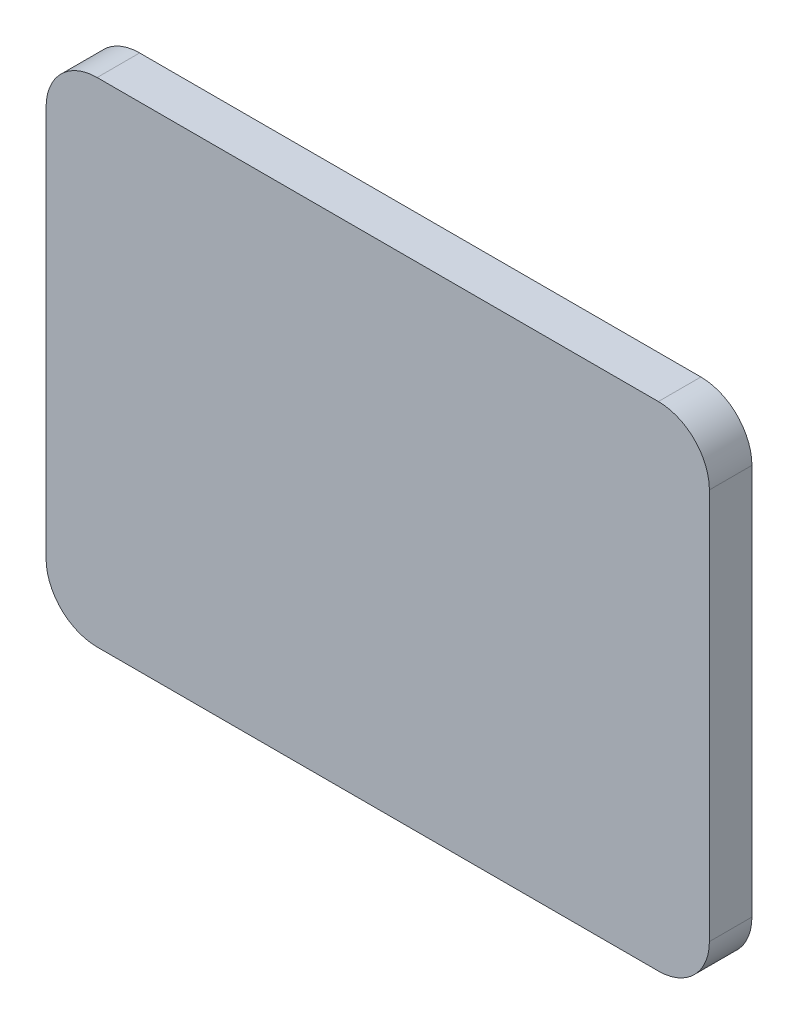
ISO-10303-21;
HEADER;
FILE_DESCRIPTION(('STEP AP214'),'2;1');
FILE_NAME('part.step','',(''),(''),'','','');
FILE_SCHEMA(('AUTOMOTIVE_DESIGN { 1 0 10303 214 1 1 1 1 }'));
ENDSEC;
DATA;
#1=APPLICATION_CONTEXT('core data for automotive mechanical design processes');
#2=APPLICATION_PROTOCOL_DEFINITION('international standard','automotive_design',2000,#1);
#3=PRODUCT_CONTEXT('',#1,'mechanical');
#4=PRODUCT('Part','Part','',(#3));
#5=PRODUCT_RELATED_PRODUCT_CATEGORY('part','',(#4));
#6=PRODUCT_DEFINITION_FORMATION('','',#4);
#7=PRODUCT_DEFINITION_CONTEXT('part definition',#1,'design');
#8=PRODUCT_DEFINITION('design','',#6,#7);
#9=PRODUCT_DEFINITION_SHAPE('','',#8);
#10=(LENGTH_UNIT() NAMED_UNIT(*) SI_UNIT(.MILLI.,.METRE.));
#11=(NAMED_UNIT(*) PLANE_ANGLE_UNIT() SI_UNIT($,.RADIAN.));
#12=(NAMED_UNIT(*) SI_UNIT($,.STERADIAN.) SOLID_ANGLE_UNIT());
#13=UNCERTAINTY_MEASURE_WITH_UNIT(LENGTH_MEASURE(1.E-05),#10,'distance_accuracy_value','');
#14=(GEOMETRIC_REPRESENTATION_CONTEXT(3) GLOBAL_UNCERTAINTY_ASSIGNED_CONTEXT((#13)) GLOBAL_UNIT_ASSIGNED_CONTEXT((#10,
#11,#12)) REPRESENTATION_CONTEXT('',''));
#15=CARTESIAN_POINT('',(0.,0.,0.));
#16=DIRECTION('',(0.,0.,1.));
#17=DIRECTION('',(1.,0.,0.));
#18=AXIS2_PLACEMENT_3D('',#15,#16,#17);
#19=CARTESIAN_POINT('',(49.53,36.83,6.35));
#20=DIRECTION('',(-1.,0.,0.));
#21=DIRECTION('',(0.,-1.,0.));
#22=AXIS2_PLACEMENT_3D('',#19,#20,#21);
#23=PLANE('',#22);
#24=DIRECTION('',(0.,1.,0.));
#25=VECTOR('',#24,1.);
#26=CARTESIAN_POINT('',(49.53,36.83,6.35));
#27=LINE('',#26,#25);
#28=CARTESIAN_POINT('',(49.53,-29.21,6.35));
#29=VERTEX_POINT('',#28);
#30=CARTESIAN_POINT('',(49.53,29.21,6.35));
#31=VERTEX_POINT('',#30);
#32=EDGE_CURVE('E139',#29,#31,#27,.T.);
#33=ORIENTED_EDGE('',*,*,#32,.F.);
#34=DIRECTION('',(0.,0.,-1.));
#35=VECTOR('',#34,1.);
#36=CARTESIAN_POINT('',(49.53,-29.21,6.35));
#37=LINE('',#36,#35);
#38=CARTESIAN_POINT('',(49.53,-29.21,0.));
#39=VERTEX_POINT('',#38);
#40=EDGE_CURVE('E178',#29,#39,#37,.T.);
#41=ORIENTED_EDGE('',*,*,#40,.T.);
#42=DIRECTION('',(0.,1.,0.));
#43=VECTOR('',#42,1.);
#44=CARTESIAN_POINT('',(49.53,36.83,0.));
#45=LINE('',#44,#43);
#46=CARTESIAN_POINT('',(49.53,29.21,0.));
#47=VERTEX_POINT('',#46);
#48=EDGE_CURVE('E192',#39,#47,#45,.T.);
#49=ORIENTED_EDGE('',*,*,#48,.T.);
#50=DIRECTION('',(0.,0.,-1.));
#51=VECTOR('',#50,1.);
#52=CARTESIAN_POINT('',(49.53,29.21,6.35));
#53=LINE('',#52,#51);
#54=EDGE_CURVE('E175',#47,#31,#53,.F.);
#55=ORIENTED_EDGE('',*,*,#54,.T.);
#56=EDGE_LOOP('',(#33,#41,#49,#55));
#57=FACE_BOUND('',#56,.T.);
#58=ADVANCED_FACE('F43',(#57),#23,.F.);
#59=CARTESIAN_POINT('',(-49.53,36.83,6.35));
#60=DIRECTION('',(0.,-1.,0.));
#61=DIRECTION('',(0.,0.,-1.));
#62=AXIS2_PLACEMENT_3D('',#59,#60,#61);
#63=PLANE('',#62);
#64=DIRECTION('',(-1.,0.,0.));
#65=VECTOR('',#64,1.);
#66=CARTESIAN_POINT('',(-49.53,36.83,6.35));
#67=LINE('',#66,#65);
#68=CARTESIAN_POINT('',(41.91,36.83,6.35));
#69=VERTEX_POINT('',#68);
#70=CARTESIAN_POINT('',(-41.91,36.83,6.35));
#71=VERTEX_POINT('',#70);
#72=EDGE_CURVE('E144',#69,#71,#67,.T.);
#73=ORIENTED_EDGE('',*,*,#72,.F.);
#74=DIRECTION('',(0.,0.,-1.));
#75=VECTOR('',#74,1.);
#76=CARTESIAN_POINT('',(41.91,36.83,6.35));
#77=LINE('',#76,#75);
#78=CARTESIAN_POINT('',(41.91,36.83,0.));
#79=VERTEX_POINT('',#78);
#80=EDGE_CURVE('E11',#69,#79,#77,.T.);
#81=ORIENTED_EDGE('',*,*,#80,.T.);
#82=DIRECTION('',(-1.,0.,0.));
#83=VECTOR('',#82,1.);
#84=CARTESIAN_POINT('',(-49.53,36.83,0.));
#85=LINE('',#84,#83);
#86=CARTESIAN_POINT('',(-41.91,36.83,0.));
#87=VERTEX_POINT('',#86);
#88=EDGE_CURVE('E146',#79,#87,#85,.T.);
#89=ORIENTED_EDGE('',*,*,#88,.T.);
#90=DIRECTION('',(0.,0.,-1.));
#91=VECTOR('',#90,1.);
#92=CARTESIAN_POINT('',(-41.91,36.83,6.35));
#93=LINE('',#92,#91);
#94=EDGE_CURVE('E52',#87,#71,#93,.F.);
#95=ORIENTED_EDGE('',*,*,#94,.T.);
#96=EDGE_LOOP('',(#73,#81,#89,#95));
#97=FACE_BOUND('',#96,.T.);
#98=ADVANCED_FACE('F197',(#97),#63,.F.);
#99=CARTESIAN_POINT('',(-49.53,36.83,6.35));
#100=DIRECTION('',(1.,0.,0.));
#101=DIRECTION('',(0.,1.,0.));
#102=AXIS2_PLACEMENT_3D('',#99,#100,#101);
#103=PLANE('',#102);
#104=DIRECTION('',(0.,-1.,0.));
#105=VECTOR('',#104,1.);
#106=CARTESIAN_POINT('',(-49.53,36.83,0.));
#107=LINE('',#106,#105);
#108=CARTESIAN_POINT('',(-49.53,29.21,0.));
#109=VERTEX_POINT('',#108);
#110=CARTESIAN_POINT('',(-49.53,-29.21,0.));
#111=VERTEX_POINT('',#110);
#112=EDGE_CURVE('E140',#109,#111,#107,.T.);
#113=ORIENTED_EDGE('',*,*,#112,.T.);
#114=DIRECTION('',(0.,0.,-1.));
#115=VECTOR('',#114,1.);
#116=CARTESIAN_POINT('',(-49.53,-29.21,6.35));
#117=LINE('',#116,#115);
#118=CARTESIAN_POINT('',(-49.53,-29.21,6.35));
#119=VERTEX_POINT('',#118);
#120=EDGE_CURVE('E115',#111,#119,#117,.F.);
#121=ORIENTED_EDGE('',*,*,#120,.T.);
#122=DIRECTION('',(0.,-1.,0.));
#123=VECTOR('',#122,1.);
#124=CARTESIAN_POINT('',(-49.53,36.83,6.35));
#125=LINE('',#124,#123);
#126=CARTESIAN_POINT('',(-49.53,29.21,6.35));
#127=VERTEX_POINT('',#126);
#128=EDGE_CURVE('E184',#127,#119,#125,.T.);
#129=ORIENTED_EDGE('',*,*,#128,.F.);
#130=DIRECTION('',(0.,0.,-1.));
#131=VECTOR('',#130,1.);
#132=CARTESIAN_POINT('',(-49.53,29.21,6.35));
#133=LINE('',#132,#131);
#134=EDGE_CURVE('E121',#127,#109,#133,.T.);
#135=ORIENTED_EDGE('',*,*,#134,.T.);
#136=EDGE_LOOP('',(#113,#121,#129,#135));
#137=FACE_BOUND('',#136,.T.);
#138=ADVANCED_FACE('F204',(#137),#103,.F.);
#139=CARTESIAN_POINT('',(-49.53,-36.83,6.35));
#140=DIRECTION('',(0.,1.,0.));
#141=DIRECTION('',(0.,0.,1.));
#142=AXIS2_PLACEMENT_3D('',#139,#140,#141);
#143=PLANE('',#142);
#144=DIRECTION('',(1.,0.,0.));
#145=VECTOR('',#144,1.);
#146=CARTESIAN_POINT('',(-49.53,-36.83,6.35));
#147=LINE('',#146,#145);
#148=CARTESIAN_POINT('',(-41.91,-36.83,6.35));
#149=VERTEX_POINT('',#148);
#150=CARTESIAN_POINT('',(41.91,-36.83,6.35));
#151=VERTEX_POINT('',#150);
#152=EDGE_CURVE('E131',#149,#151,#147,.T.);
#153=ORIENTED_EDGE('',*,*,#152,.F.);
#154=DIRECTION('',(0.,0.,-1.));
#155=VECTOR('',#154,1.);
#156=CARTESIAN_POINT('',(-41.91,-36.83,6.35));
#157=LINE('',#156,#155);
#158=CARTESIAN_POINT('',(-41.91,-36.83,0.));
#159=VERTEX_POINT('',#158);
#160=EDGE_CURVE('E114',#149,#159,#157,.T.);
#161=ORIENTED_EDGE('',*,*,#160,.T.);
#162=DIRECTION('',(1.,0.,0.));
#163=VECTOR('',#162,1.);
#164=CARTESIAN_POINT('',(-49.53,-36.83,0.));
#165=LINE('',#164,#163);
#166=CARTESIAN_POINT('',(41.91,-36.83,0.));
#167=VERTEX_POINT('',#166);
#168=EDGE_CURVE('E128',#159,#167,#165,.T.);
#169=ORIENTED_EDGE('',*,*,#168,.T.);
#170=DIRECTION('',(0.,0.,-1.));
#171=VECTOR('',#170,1.);
#172=CARTESIAN_POINT('',(41.91,-36.83,6.35));
#173=LINE('',#172,#171);
#174=EDGE_CURVE('E134',#167,#151,#173,.F.);
#175=ORIENTED_EDGE('',*,*,#174,.T.);
#176=EDGE_LOOP('',(#153,#161,#169,#175));
#177=FACE_BOUND('',#176,.T.);
#178=ADVANCED_FACE('F127',(#177),#143,.F.);
#179=CARTESIAN_POINT('',(0.,0.,6.35));
#180=DIRECTION('',(0.,0.,1.));
#181=DIRECTION('',(1.,0.,0.));
#182=AXIS2_PLACEMENT_3D('',#179,#180,#181);
#183=PLANE('',#182);
#184=ORIENTED_EDGE('',*,*,#128,.T.);
#185=CARTESIAN_POINT('',(-41.91,-29.21,6.35));
#186=DIRECTION('',(0.,0.,1.));
#187=DIRECTION('',(1.,0.,0.));
#188=AXIS2_PLACEMENT_3D('',#185,#186,#187);
#189=CIRCLE('',#188,7.62);
#190=EDGE_CURVE('E172',#119,#149,#189,.T.);
#191=ORIENTED_EDGE('',*,*,#190,.T.);
#192=ORIENTED_EDGE('',*,*,#152,.T.);
#193=CARTESIAN_POINT('',(41.91,-29.21,6.35));
#194=DIRECTION('',(0.,0.,1.));
#195=DIRECTION('',(1.,0.,0.));
#196=AXIS2_PLACEMENT_3D('',#193,#194,#195);
#197=CIRCLE('',#196,7.62);
#198=EDGE_CURVE('E169',#151,#29,#197,.T.);
#199=ORIENTED_EDGE('',*,*,#198,.T.);
#200=ORIENTED_EDGE('',*,*,#32,.T.);
#201=CARTESIAN_POINT('',(41.91,29.21,6.35));
#202=DIRECTION('',(0.,0.,1.));
#203=DIRECTION('',(1.,0.,0.));
#204=AXIS2_PLACEMENT_3D('',#201,#202,#203);
#205=CIRCLE('',#204,7.62);
#206=EDGE_CURVE('E65',#31,#69,#205,.T.);
#207=ORIENTED_EDGE('',*,*,#206,.T.);
#208=ORIENTED_EDGE('',*,*,#72,.T.);
#209=CARTESIAN_POINT('',(-41.91,29.21,6.35));
#210=DIRECTION('',(0.,0.,1.));
#211=DIRECTION('',(1.,0.,0.));
#212=AXIS2_PLACEMENT_3D('',#209,#210,#211);
#213=CIRCLE('',#212,7.62);
#214=EDGE_CURVE('E164',#71,#127,#213,.T.);
#215=ORIENTED_EDGE('',*,*,#214,.T.);
#216=EDGE_LOOP('',(#184,#191,#192,#199,#200,#207,#208,#215));
#217=FACE_BOUND('',#216,.T.);
#218=ADVANCED_FACE('F202',(#217),#183,.T.);
#219=CARTESIAN_POINT('',(0.,0.,0.));
#220=DIRECTION('',(0.,0.,1.));
#221=DIRECTION('',(1.,0.,0.));
#222=AXIS2_PLACEMENT_3D('',#219,#220,#221);
#223=PLANE('',#222);
#224=ORIENTED_EDGE('',*,*,#168,.F.);
#225=CARTESIAN_POINT('',(-41.91,-29.21,0.));
#226=DIRECTION('',(0.,0.,1.));
#227=DIRECTION('',(1.,0.,0.));
#228=AXIS2_PLACEMENT_3D('',#225,#226,#227);
#229=CIRCLE('',#228,7.62);
#230=EDGE_CURVE('E110',#159,#111,#229,.F.);
#231=ORIENTED_EDGE('',*,*,#230,.T.);
#232=ORIENTED_EDGE('',*,*,#112,.F.);
#233=CARTESIAN_POINT('',(-41.91,29.21,0.));
#234=DIRECTION('',(0.,0.,1.));
#235=DIRECTION('',(1.,0.,0.));
#236=AXIS2_PLACEMENT_3D('',#233,#234,#235);
#237=CIRCLE('',#236,7.62);
#238=EDGE_CURVE('E133',#109,#87,#237,.F.);
#239=ORIENTED_EDGE('',*,*,#238,.T.);
#240=ORIENTED_EDGE('',*,*,#88,.F.);
#241=CARTESIAN_POINT('',(41.91,29.21,0.));
#242=DIRECTION('',(0.,0.,1.));
#243=DIRECTION('',(1.,0.,0.));
#244=AXIS2_PLACEMENT_3D('',#241,#242,#243);
#245=CIRCLE('',#244,7.62);
#246=EDGE_CURVE('E154',#79,#47,#245,.F.);
#247=ORIENTED_EDGE('',*,*,#246,.T.);
#248=ORIENTED_EDGE('',*,*,#48,.F.);
#249=CARTESIAN_POINT('',(41.91,-29.21,0.));
#250=DIRECTION('',(0.,0.,1.));
#251=DIRECTION('',(1.,0.,0.));
#252=AXIS2_PLACEMENT_3D('',#249,#250,#251);
#253=CIRCLE('',#252,7.62);
#254=EDGE_CURVE('E122',#39,#167,#253,.F.);
#255=ORIENTED_EDGE('',*,*,#254,.T.);
#256=EDGE_LOOP('',(#224,#231,#232,#239,#240,#247,#248,#255));
#257=FACE_BOUND('',#256,.T.);
#258=ADVANCED_FACE('F136',(#257),#223,.F.);
#259=CARTESIAN_POINT('',(-41.91,-29.21,6.35));
#260=DIRECTION('',(0.,0.,-1.));
#261=DIRECTION('',(-1.,0.,0.));
#262=AXIS2_PLACEMENT_3D('',#259,#260,#261);
#263=CYLINDRICAL_SURFACE('',#262,7.62);
#264=ORIENTED_EDGE('',*,*,#190,.F.);
#265=ORIENTED_EDGE('',*,*,#120,.F.);
#266=ORIENTED_EDGE('',*,*,#230,.F.);
#267=ORIENTED_EDGE('',*,*,#160,.F.);
#268=EDGE_LOOP('',(#264,#265,#266,#267));
#269=FACE_BOUND('',#268,.T.);
#270=ADVANCED_FACE('F113',(#269),#263,.T.);
#271=CARTESIAN_POINT('',(41.91,-29.21,6.35));
#272=DIRECTION('',(0.,0.,-1.));
#273=DIRECTION('',(-1.,0.,0.));
#274=AXIS2_PLACEMENT_3D('',#271,#272,#273);
#275=CYLINDRICAL_SURFACE('',#274,7.62);
#276=ORIENTED_EDGE('',*,*,#198,.F.);
#277=ORIENTED_EDGE('',*,*,#174,.F.);
#278=ORIENTED_EDGE('',*,*,#254,.F.);
#279=ORIENTED_EDGE('',*,*,#40,.F.);
#280=EDGE_LOOP('',(#276,#277,#278,#279));
#281=FACE_BOUND('',#280,.T.);
#282=ADVANCED_FACE('F222',(#281),#275,.T.);
#283=CARTESIAN_POINT('',(41.91,29.21,6.35));
#284=DIRECTION('',(0.,0.,-1.));
#285=DIRECTION('',(-1.,0.,0.));
#286=AXIS2_PLACEMENT_3D('',#283,#284,#285);
#287=CYLINDRICAL_SURFACE('',#286,7.62);
#288=ORIENTED_EDGE('',*,*,#206,.F.);
#289=ORIENTED_EDGE('',*,*,#54,.F.);
#290=ORIENTED_EDGE('',*,*,#246,.F.);
#291=ORIENTED_EDGE('',*,*,#80,.F.);
#292=EDGE_LOOP('',(#288,#289,#290,#291));
#293=FACE_BOUND('',#292,.T.);
#294=ADVANCED_FACE('F224',(#293),#287,.T.);
#295=CARTESIAN_POINT('',(-41.91,29.21,6.35));
#296=DIRECTION('',(0.,0.,-1.));
#297=DIRECTION('',(-1.,0.,0.));
#298=AXIS2_PLACEMENT_3D('',#295,#296,#297);
#299=CYLINDRICAL_SURFACE('',#298,7.62);
#300=ORIENTED_EDGE('',*,*,#214,.F.);
#301=ORIENTED_EDGE('',*,*,#94,.F.);
#302=ORIENTED_EDGE('',*,*,#238,.F.);
#303=ORIENTED_EDGE('',*,*,#134,.F.);
#304=EDGE_LOOP('',(#300,#301,#302,#303));
#305=FACE_BOUND('',#304,.T.);
#306=ADVANCED_FACE('F45',(#305),#299,.T.);
#307=CLOSED_SHELL('',(#58,#98,#138,#178,#218,#258,#270,#282,#294,#306));
#308=MANIFOLD_SOLID_BREP('B2',#307);
#309=ADVANCED_BREP_SHAPE_REPRESENTATION('',(#18,#308),#14);
#310=SHAPE_DEFINITION_REPRESENTATION(#9,#309);
ENDSEC;
END-ISO-10303-21;
